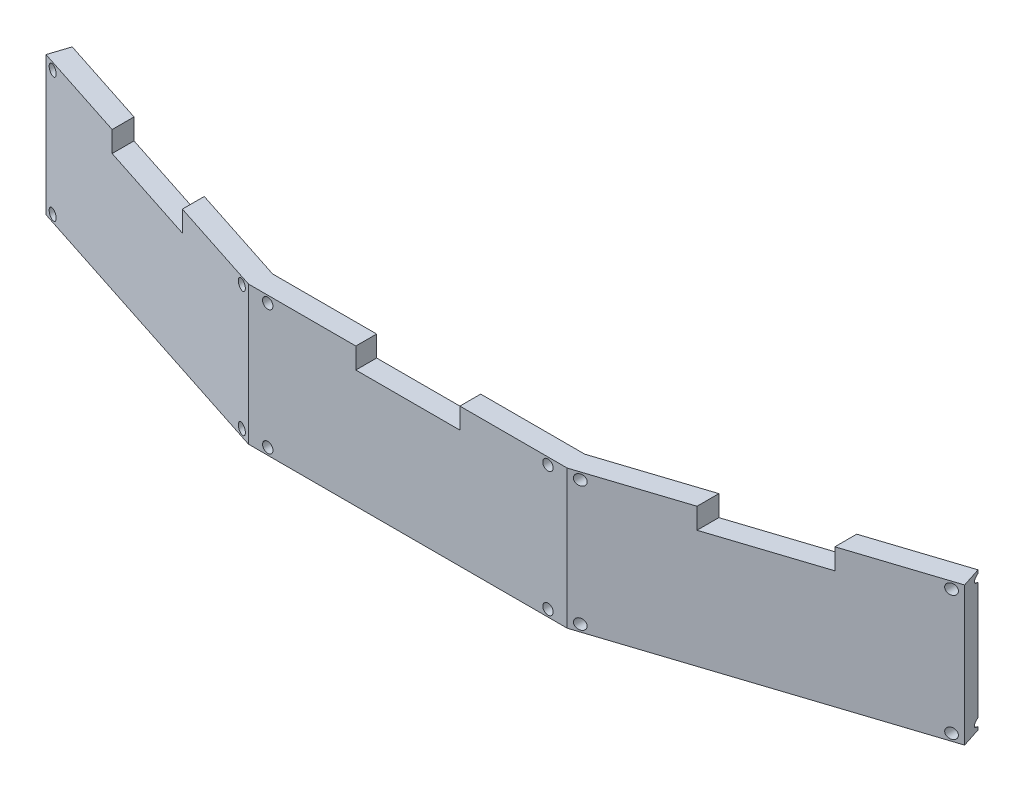
ISO-10303-21;
HEADER;
FILE_DESCRIPTION(('STEP AP214'),'2;1');
FILE_NAME('part.step','',(''),(''),'','','');
FILE_SCHEMA(('AUTOMOTIVE_DESIGN { 1 0 10303 214 1 1 1 1 }'));
ENDSEC;
DATA;
#1=APPLICATION_CONTEXT('core data for automotive mechanical design processes');
#2=APPLICATION_PROTOCOL_DEFINITION('international standard','automotive_design',2000,#1);
#3=PRODUCT_CONTEXT('',#1,'mechanical');
#4=PRODUCT('Part','Part','',(#3));
#5=PRODUCT_RELATED_PRODUCT_CATEGORY('part','',(#4));
#6=PRODUCT_DEFINITION_FORMATION('','',#4);
#7=PRODUCT_DEFINITION_CONTEXT('part definition',#1,'design');
#8=PRODUCT_DEFINITION('design','',#6,#7);
#9=PRODUCT_DEFINITION_SHAPE('','',#8);
#10=(LENGTH_UNIT() NAMED_UNIT(*) SI_UNIT(.MILLI.,.METRE.));
#11=(NAMED_UNIT(*) PLANE_ANGLE_UNIT() SI_UNIT($,.RADIAN.));
#12=(NAMED_UNIT(*) SI_UNIT($,.STERADIAN.) SOLID_ANGLE_UNIT());
#13=UNCERTAINTY_MEASURE_WITH_UNIT(LENGTH_MEASURE(1.E-05),#10,'distance_accuracy_value','');
#14=(GEOMETRIC_REPRESENTATION_CONTEXT(3) GLOBAL_UNCERTAINTY_ASSIGNED_CONTEXT((#13)) GLOBAL_UNIT_ASSIGNED_CONTEXT((#10,
#11,#12)) REPRESENTATION_CONTEXT('',''));
#15=CARTESIAN_POINT('',(0.,0.,0.));
#16=DIRECTION('',(0.,0.,1.));
#17=DIRECTION('',(1.,0.,0.));
#18=AXIS2_PLACEMENT_3D('',#15,#16,#17);
#19=CARTESIAN_POINT('',(0.,0.,0.));
#20=DIRECTION('',(0.,-1.,0.));
#21=DIRECTION('',(-1.,0.,0.));
#22=AXIS2_PLACEMENT_3D('',#19,#20,#21);
#23=PLANE('',#22);
#24=DIRECTION('',(0.951056516295156,0.,-0.309016994374941));
#25=VECTOR('',#24,1.);
#26=CARTESIAN_POINT('',(23.4270509831248,0.,2.85316954888546));
#27=LINE('',#26,#25);
#28=CARTESIAN_POINT('',(22.9751533209736,0.,2.99999999999999));
#29=VERTEX_POINT('',#28);
#30=CARTESIAN_POINT('',(37.0998737686902,0.,-1.58939987724671));
#31=VERTEX_POINT('',#30);
#32=EDGE_CURVE('E356',#29,#31,#27,.T.);
#33=ORIENTED_EDGE('',*,*,#32,.T.);
#34=DIRECTION('',(0.,0.,-1.));
#35=VECTOR('',#34,1.);
#36=CARTESIAN_POINT('',(37.0998737686902,0.,0.));
#37=LINE('',#36,#35);
#38=CARTESIAN_POINT('',(37.0998737686902,0.,-4.74378654996151));
#39=VERTEX_POINT('',#38);
#40=EDGE_CURVE('E443',#31,#39,#37,.T.);
#41=ORIENTED_EDGE('',*,*,#40,.T.);
#42=DIRECTION('',(0.951056516295156,0.,-0.309016994374941));
#43=VECTOR('',#42,1.);
#44=CARTESIAN_POINT('',(22.5,0.,0.));
#45=LINE('',#44,#43);
#46=CARTESIAN_POINT('',(22.5,0.,0.));
#47=VERTEX_POINT('',#46);
#48=EDGE_CURVE('E365',#47,#39,#45,.T.);
#49=ORIENTED_EDGE('',*,*,#48,.F.);
#50=DIRECTION('',(1.,0.,0.));
#51=VECTOR('',#50,1.);
#52=CARTESIAN_POINT('',(-22.5,0.,0.));
#53=LINE('',#52,#51);
#54=CARTESIAN_POINT('',(7.5,0.,0.));
#55=VERTEX_POINT('',#54);
#56=EDGE_CURVE('E369',#55,#47,#53,.T.);
#57=ORIENTED_EDGE('',*,*,#56,.F.);
#58=DIRECTION('',(0.,0.,1.));
#59=VECTOR('',#58,1.);
#60=CARTESIAN_POINT('',(7.5,0.,0.));
#61=LINE('',#60,#59);
#62=CARTESIAN_POINT('',(7.5,0.,2.99999999999999));
#63=VERTEX_POINT('',#62);
#64=EDGE_CURVE('E395',#55,#63,#61,.T.);
#65=ORIENTED_EDGE('',*,*,#64,.T.);
#66=DIRECTION('',(1.,0.,0.));
#67=VECTOR('',#66,1.);
#68=CARTESIAN_POINT('',(-22.5,0.,3.));
#69=LINE('',#68,#67);
#70=EDGE_CURVE('E388',#63,#29,#69,.T.);
#71=ORIENTED_EDGE('',*,*,#70,.T.);
#72=EDGE_LOOP('',(#33,#41,#49,#57,#65,#71));
#73=FACE_BOUND('',#72,.T.);
#74=ADVANCED_FACE('F39',(#73),#23,.F.);
#75=DIRECTION('',(0.951056516295156,0.,0.309016994374941));
#76=VECTOR('',#75,1.);
#77=CARTESIAN_POINT('',(-22.5,0.,0.));
#78=LINE('',#77,#76);
#79=CARTESIAN_POINT('',(-37.0998737686902,-2.21748724036974E-13,-4.7437865499615));
#80=VERTEX_POINT('',#79);
#81=CARTESIAN_POINT('',(-22.5,0.,0.));
#82=VERTEX_POINT('',#81);
#83=EDGE_CURVE('E374',#80,#82,#78,.T.);
#84=ORIENTED_EDGE('',*,*,#83,.F.);
#85=DIRECTION('',(0.,0.,1.));
#86=VECTOR('',#85,1.);
#87=CARTESIAN_POINT('',(-37.0998737686902,0.,0.));
#88=LINE('',#87,#86);
#89=CARTESIAN_POINT('',(-37.0998737686902,-2.21748724036974E-13,-1.58939987724671));
#90=VERTEX_POINT('',#89);
#91=EDGE_CURVE('E435',#80,#90,#88,.T.);
#92=ORIENTED_EDGE('',*,*,#91,.T.);
#93=DIRECTION('',(0.951056516295156,0.,0.309016994374941));
#94=VECTOR('',#93,1.);
#95=CARTESIAN_POINT('',(-23.4270509831248,0.,2.85316954888547));
#96=LINE('',#95,#94);
#97=CARTESIAN_POINT('',(-22.9751533209736,0.,3.));
#98=VERTEX_POINT('',#97);
#99=EDGE_CURVE('E383',#90,#98,#96,.T.);
#100=ORIENTED_EDGE('',*,*,#99,.T.);
#101=CARTESIAN_POINT('',(-7.5,0.,3.));
#102=VERTEX_POINT('',#101);
#103=EDGE_CURVE('E332',#98,#102,#69,.T.);
#104=ORIENTED_EDGE('',*,*,#103,.T.);
#105=DIRECTION('',(0.,0.,-1.));
#106=VECTOR('',#105,1.);
#107=CARTESIAN_POINT('',(-7.5,0.,0.));
#108=LINE('',#107,#106);
#109=CARTESIAN_POINT('',(-7.5,0.,0.));
#110=VERTEX_POINT('',#109);
#111=EDGE_CURVE('E219',#102,#110,#108,.T.);
#112=ORIENTED_EDGE('',*,*,#111,.T.);
#113=EDGE_CURVE('E370',#82,#110,#53,.T.);
#114=ORIENTED_EDGE('',*,*,#113,.F.);
#115=EDGE_LOOP('',(#84,#92,#100,#104,#112,#114));
#116=FACE_BOUND('',#115,.T.);
#117=ADVANCED_FACE('F514',(#116),#23,.F.);
#118=CARTESIAN_POINT('',(-66.2245942164068,0.,-11.0525951979869));
#119=VERTEX_POINT('',#118);
#120=CARTESIAN_POINT('',(-52.0998737686902,-4.41037873663923E-13,-6.46319532074019));
#121=VERTEX_POINT('',#120);
#122=EDGE_CURVE('E384',#119,#121,#96,.T.);
#123=ORIENTED_EDGE('',*,*,#122,.T.);
#124=DIRECTION('',(0.,0.,-1.));
#125=VECTOR('',#124,1.);
#126=CARTESIAN_POINT('',(-52.0998737686902,0.,0.));
#127=LINE('',#126,#125);
#128=CARTESIAN_POINT('',(-52.0998737686902,0.,-9.61758199345499));
#129=VERTEX_POINT('',#128);
#130=EDGE_CURVE('E431',#121,#129,#127,.T.);
#131=ORIENTED_EDGE('',*,*,#130,.T.);
#132=CARTESIAN_POINT('',(-65.297543233282,0.,-13.9057647468724));
#133=VERTEX_POINT('',#132);
#134=EDGE_CURVE('E375',#133,#129,#78,.T.);
#135=ORIENTED_EDGE('',*,*,#134,.F.);
#136=DIRECTION('',(0.309016994374943,0.,-0.951056516295155));
#137=VECTOR('',#136,1.);
#138=CARTESIAN_POINT('',(-66.2245942164068,0.,-11.0525951979869));
#139=LINE('',#138,#137);
#140=EDGE_CURVE('E379',#119,#133,#139,.T.);
#141=ORIENTED_EDGE('',*,*,#140,.F.);
#142=EDGE_LOOP('',(#123,#131,#135,#141));
#143=FACE_BOUND('',#142,.T.);
#144=ADVANCED_FACE('F521',(#143),#23,.F.);
#145=CARTESIAN_POINT('',(23.4270509831248,-20.,2.85316954888546));
#146=DIRECTION('',(0.309016994374941,0.,0.951056516295156));
#147=DIRECTION('',(0.951056516295156,0.,-0.309016994374941));
#148=AXIS2_PLACEMENT_3D('',#145,#146,#147);
#149=PLANE('',#148);
#150=CARTESIAN_POINT('',(24.3998737686902,-0.999999999999996,2.53708026491111));
#151=DIRECTION('',(0.309016994374941,0.,0.951056516295156));
#152=DIRECTION('',(-0.951056516295156,0.,0.309016994374941));
#153=AXIS2_PLACEMENT_3D('',#150,#151,#152);
#154=ELLIPSE('',#153,0.788596668178701,0.750000000000002);
#155=CARTESIAN_POINT('',(23.6498737686902,-0.999999999999996,2.78077003708578));
#156=VERTEX_POINT('',#155);
#157=EDGE_CURVE('E296',#156,#156,#154,.T.);
#158=ORIENTED_EDGE('',*,*,#157,.F.);
#159=EDGE_LOOP('',(#158));
#160=FACE_BOUND('',#159,.T.);
#161=CARTESIAN_POINT('',(64.7998737686902,-1.,-10.589675462898));
#162=DIRECTION('',(0.309016994374941,0.,0.951056516295156));
#163=DIRECTION('',(-0.951056516295156,0.,0.309016994374941));
#164=AXIS2_PLACEMENT_3D('',#161,#162,#163);
#165=ELLIPSE('',#164,0.788596668178697,0.749999999999999);
#166=CARTESIAN_POINT('',(64.0498737686902,-1.,-10.3459856907233));
#167=VERTEX_POINT('',#166);
#168=EDGE_CURVE('E283',#167,#167,#165,.T.);
#169=ORIENTED_EDGE('',*,*,#168,.F.);
#170=EDGE_LOOP('',(#169));
#171=FACE_BOUND('',#170,.T.);
#172=DIRECTION('',(0.,-1.,0.));
#173=VECTOR('',#172,1.);
#174=CARTESIAN_POINT('',(37.0998737686902,-20.,-1.58939987724671));
#175=LINE('',#174,#173);
#176=CARTESIAN_POINT('',(37.0998737686902,-3.,-1.58939987724671));
#177=VERTEX_POINT('',#176);
#178=EDGE_CURVE('E268',#31,#177,#175,.T.);
#179=ORIENTED_EDGE('',*,*,#178,.F.);
#180=ORIENTED_EDGE('',*,*,#32,.F.);
#181=DIRECTION('',(0.,1.,0.));
#182=VECTOR('',#181,1.);
#183=CARTESIAN_POINT('',(22.9751533209736,-20.,2.99999999999999));
#184=LINE('',#183,#182);
#185=CARTESIAN_POINT('',(22.9751533209736,-20.,2.99999999999999));
#186=VERTEX_POINT('',#185);
#187=EDGE_CURVE('E391',#186,#29,#184,.T.);
#188=ORIENTED_EDGE('',*,*,#187,.F.);
#189=DIRECTION('',(0.951056516295156,0.,-0.309016994374941));
#190=VECTOR('',#189,1.);
#191=CARTESIAN_POINT('',(23.4270509831248,-20.,2.85316954888546));
#192=LINE('',#191,#190);
#193=CARTESIAN_POINT('',(66.2245942164068,-20.,-11.0525951979869));
#194=VERTEX_POINT('',#193);
#195=EDGE_CURVE('E327',#186,#194,#192,.T.);
#196=ORIENTED_EDGE('',*,*,#195,.T.);
#197=DIRECTION('',(0.,1.,0.));
#198=VECTOR('',#197,1.);
#199=CARTESIAN_POINT('',(66.2245942164068,-20.,-11.0525951979869));
#200=LINE('',#199,#198);
#201=CARTESIAN_POINT('',(66.2245942164068,0.,-11.0525951979869));
#202=VERTEX_POINT('',#201);
#203=EDGE_CURVE('E355',#194,#202,#200,.T.);
#204=ORIENTED_EDGE('',*,*,#203,.T.);
#205=CARTESIAN_POINT('',(52.0998737686902,0.,-6.4631953207402));
#206=VERTEX_POINT('',#205);
#207=EDGE_CURVE('E326',#206,#202,#27,.T.);
#208=ORIENTED_EDGE('',*,*,#207,.F.);
#209=DIRECTION('',(0.,1.,0.));
#210=VECTOR('',#209,1.);
#211=CARTESIAN_POINT('',(52.0998737686902,-20.,-6.46319532074019));
#212=LINE('',#211,#210);
#213=CARTESIAN_POINT('',(52.0998737686902,-3.,-6.4631953207402));
#214=VERTEX_POINT('',#213);
#215=EDGE_CURVE('E261',#214,#206,#212,.T.);
#216=ORIENTED_EDGE('',*,*,#215,.F.);
#217=DIRECTION('',(0.951056516295156,0.,-0.309016994374941));
#218=VECTOR('',#217,1.);
#219=CARTESIAN_POINT('',(23.4270509831248,-3.,2.85316954888546));
#220=LINE('',#219,#218);
#221=EDGE_CURVE('E292',#177,#214,#220,.T.);
#222=ORIENTED_EDGE('',*,*,#221,.F.);
#223=EDGE_LOOP('',(#179,#180,#188,#196,#204,#208,#216,#222));
#224=FACE_BOUND('',#223,.T.);
#225=CARTESIAN_POINT('',(24.3998737686902,-19.,2.53708026491111));
#226=DIRECTION('',(0.309016994374941,0.,0.951056516295156));
#227=DIRECTION('',(-0.951056516295156,0.,0.309016994374941));
#228=AXIS2_PLACEMENT_3D('',#225,#226,#227);
#229=ELLIPSE('',#228,0.788596668178701,0.750000000000002);
#230=CARTESIAN_POINT('',(23.6498737686902,-19.,2.78077003708578));
#231=VERTEX_POINT('',#230);
#232=EDGE_CURVE('E288',#231,#231,#229,.T.);
#233=ORIENTED_EDGE('',*,*,#232,.F.);
#234=EDGE_LOOP('',(#233));
#235=FACE_BOUND('',#234,.T.);
#236=CARTESIAN_POINT('',(64.7998737686902,-19.,-10.589675462898));
#237=DIRECTION('',(0.309016994374941,0.,0.951056516295156));
#238=DIRECTION('',(-0.951056516295156,0.,0.309016994374941));
#239=AXIS2_PLACEMENT_3D('',#236,#237,#238);
#240=ELLIPSE('',#239,0.788596668178697,0.749999999999999);
#241=CARTESIAN_POINT('',(64.0498737686902,-19.,-10.3459856907233));
#242=VERTEX_POINT('',#241);
#243=EDGE_CURVE('E275',#242,#242,#240,.T.);
#244=ORIENTED_EDGE('',*,*,#243,.F.);
#245=EDGE_LOOP('',(#244));
#246=FACE_BOUND('',#245,.T.);
#247=ADVANCED_FACE('F41',(#160,#171,#224,#235,#246),#149,.T.);
#248=CARTESIAN_POINT('',(-22.5,-20.,3.));
#249=DIRECTION('',(0.,0.,1.));
#250=DIRECTION('',(1.,0.,0.));
#251=AXIS2_PLACEMENT_3D('',#248,#249,#250);
#252=PLANE('',#251);
#253=CARTESIAN_POINT('',(-20.2,-19.,3.));
#254=DIRECTION('',(0.,0.,1.));
#255=DIRECTION('',(1.,0.,0.));
#256=AXIS2_PLACEMENT_3D('',#253,#254,#255);
#257=CIRCLE('',#256,0.750000000000002);
#258=CARTESIAN_POINT('',(-19.45,-19.,3.));
#259=VERTEX_POINT('',#258);
#260=EDGE_CURVE('E563',#259,#259,#257,.T.);
#261=ORIENTED_EDGE('',*,*,#260,.F.);
#262=EDGE_LOOP('',(#261));
#263=FACE_BOUND('',#262,.T.);
#264=CARTESIAN_POINT('',(20.2,-19.,3.));
#265=DIRECTION('',(0.,0.,1.));
#266=DIRECTION('',(-1.,0.,0.));
#267=AXIS2_PLACEMENT_3D('',#264,#265,#266);
#268=CIRCLE('',#267,0.750000000000002);
#269=CARTESIAN_POINT('',(19.45,-19.,3.));
#270=VERTEX_POINT('',#269);
#271=EDGE_CURVE('E569',#270,#270,#268,.T.);
#272=ORIENTED_EDGE('',*,*,#271,.F.);
#273=EDGE_LOOP('',(#272));
#274=FACE_BOUND('',#273,.T.);
#275=CARTESIAN_POINT('',(20.2,-0.999999999999996,3.));
#276=DIRECTION('',(0.,0.,1.));
#277=DIRECTION('',(-1.,0.,0.));
#278=AXIS2_PLACEMENT_3D('',#275,#276,#277);
#279=CIRCLE('',#278,0.750000000000002);
#280=CARTESIAN_POINT('',(19.45,-0.999999999999996,3.));
#281=VERTEX_POINT('',#280);
#282=EDGE_CURVE('E582',#281,#281,#279,.T.);
#283=ORIENTED_EDGE('',*,*,#282,.F.);
#284=EDGE_LOOP('',(#283));
#285=FACE_BOUND('',#284,.T.);
#286=CARTESIAN_POINT('',(-20.2,-0.999999999999996,3.));
#287=DIRECTION('',(0.,0.,1.));
#288=DIRECTION('',(1.,0.,0.));
#289=AXIS2_PLACEMENT_3D('',#286,#287,#288);
#290=CIRCLE('',#289,0.750000000000002);
#291=CARTESIAN_POINT('',(-19.45,-0.999999999999996,3.));
#292=VERTEX_POINT('',#291);
#293=EDGE_CURVE('E578',#292,#292,#290,.T.);
#294=ORIENTED_EDGE('',*,*,#293,.F.);
#295=EDGE_LOOP('',(#294));
#296=FACE_BOUND('',#295,.T.);
#297=DIRECTION('',(0.,-1.,0.));
#298=VECTOR('',#297,1.);
#299=CARTESIAN_POINT('',(-7.5,0.,3.));
#300=LINE('',#299,#298);
#301=CARTESIAN_POINT('',(-7.5,-3.,3.));
#302=VERTEX_POINT('',#301);
#303=EDGE_CURVE('E216',#102,#302,#300,.T.);
#304=ORIENTED_EDGE('',*,*,#303,.F.);
#305=ORIENTED_EDGE('',*,*,#103,.F.);
#306=DIRECTION('',(0.,1.,0.));
#307=VECTOR('',#306,1.);
#308=CARTESIAN_POINT('',(-22.9751533209736,-20.,3.));
#309=LINE('',#308,#307);
#310=CARTESIAN_POINT('',(-22.9751533209736,-20.,3.));
#311=VERTEX_POINT('',#310);
#312=EDGE_CURVE('E396',#311,#98,#309,.T.);
#313=ORIENTED_EDGE('',*,*,#312,.F.);
#314=DIRECTION('',(1.,0.,0.));
#315=VECTOR('',#314,1.);
#316=CARTESIAN_POINT('',(-22.5,-20.,3.));
#317=LINE('',#316,#315);
#318=EDGE_CURVE('E351',#311,#186,#317,.T.);
#319=ORIENTED_EDGE('',*,*,#318,.T.);
#320=ORIENTED_EDGE('',*,*,#187,.T.);
#321=ORIENTED_EDGE('',*,*,#70,.F.);
#322=DIRECTION('',(0.,1.,0.));
#323=VECTOR('',#322,1.);
#324=CARTESIAN_POINT('',(7.5,0.,3.));
#325=LINE('',#324,#323);
#326=CARTESIAN_POINT('',(7.5,-3.,3.));
#327=VERTEX_POINT('',#326);
#328=EDGE_CURVE('E213',#327,#63,#325,.T.);
#329=ORIENTED_EDGE('',*,*,#328,.F.);
#330=DIRECTION('',(1.,0.,0.));
#331=VECTOR('',#330,1.);
#332=CARTESIAN_POINT('',(-7.5,-3.,3.));
#333=LINE('',#332,#331);
#334=EDGE_CURVE('E205',#302,#327,#333,.T.);
#335=ORIENTED_EDGE('',*,*,#334,.F.);
#336=EDGE_LOOP('',(#304,#305,#313,#319,#320,#321,#329,#335));
#337=FACE_BOUND('',#336,.T.);
#338=ADVANCED_FACE('F226',(#263,#274,#285,#296,#337),#252,.T.);
#339=CARTESIAN_POINT('',(-23.4270509831248,-20.,2.85316954888547));
#340=DIRECTION('',(-0.309016994374941,0.,0.951056516295156));
#341=DIRECTION('',(0.951056516295156,0.,0.309016994374941));
#342=AXIS2_PLACEMENT_3D('',#339,#340,#341);
#343=PLANE('',#342);
#344=CARTESIAN_POINT('',(-64.7998737686902,-19.,-10.589675462898));
#345=DIRECTION('',(-0.309016994374941,0.,0.951056516295156));
#346=DIRECTION('',(0.951056516295156,0.,0.309016994374941));
#347=AXIS2_PLACEMENT_3D('',#344,#345,#346);
#348=ELLIPSE('',#347,0.788596668178697,0.749999999999999);
#349=CARTESIAN_POINT('',(-64.0498737686902,-19.,-10.3459856907233));
#350=VERTEX_POINT('',#349);
#351=EDGE_CURVE('E322',#350,#350,#348,.T.);
#352=ORIENTED_EDGE('',*,*,#351,.F.);
#353=EDGE_LOOP('',(#352));
#354=FACE_BOUND('',#353,.T.);
#355=CARTESIAN_POINT('',(-24.3998737686902,-19.,2.53708026491112));
#356=DIRECTION('',(-0.309016994374941,0.,0.951056516295156));
#357=DIRECTION('',(0.951056516295156,0.,0.309016994374941));
#358=AXIS2_PLACEMENT_3D('',#355,#356,#357);
#359=ELLIPSE('',#358,0.788596668178701,0.750000000000002);
#360=CARTESIAN_POINT('',(-23.6498737686902,-19.,2.78077003708579));
#361=VERTEX_POINT('',#360);
#362=EDGE_CURVE('E316',#361,#361,#359,.T.);
#363=ORIENTED_EDGE('',*,*,#362,.F.);
#364=EDGE_LOOP('',(#363));
#365=FACE_BOUND('',#364,.T.);
#366=DIRECTION('',(0.,1.,0.));
#367=VECTOR('',#366,1.);
#368=CARTESIAN_POINT('',(-37.0998737686901,-20.0000000000001,-1.58939987724668));
#369=LINE('',#368,#367);
#370=CARTESIAN_POINT('',(-37.0998737686902,-3.00000000000022,-1.5893998772467));
#371=VERTEX_POINT('',#370);
#372=EDGE_CURVE('E254',#371,#90,#369,.T.);
#373=ORIENTED_EDGE('',*,*,#372,.F.);
#374=DIRECTION('',(0.951056516295156,0.,0.309016994374941));
#375=VECTOR('',#374,1.);
#376=CARTESIAN_POINT('',(-23.427050983125,-3.00000000000002,2.85316954888539));
#377=LINE('',#376,#375);
#378=CARTESIAN_POINT('',(-52.0998737686902,-3.00000000000044,-6.46319532074019));
#379=VERTEX_POINT('',#378);
#380=EDGE_CURVE('E312',#379,#371,#377,.T.);
#381=ORIENTED_EDGE('',*,*,#380,.F.);
#382=DIRECTION('',(0.,-1.,0.));
#383=VECTOR('',#382,1.);
#384=CARTESIAN_POINT('',(-52.0998737686901,-20.0000000000001,-6.46319532074016));
#385=LINE('',#384,#383);
#386=EDGE_CURVE('E247',#121,#379,#385,.T.);
#387=ORIENTED_EDGE('',*,*,#386,.F.);
#388=ORIENTED_EDGE('',*,*,#122,.F.);
#389=DIRECTION('',(0.,1.,0.));
#390=VECTOR('',#389,1.);
#391=CARTESIAN_POINT('',(-66.2245942164068,-20.,-11.0525951979869));
#392=LINE('',#391,#390);
#393=CARTESIAN_POINT('',(-66.2245942164068,-20.,-11.0525951979869));
#394=VERTEX_POINT('',#393);
#395=EDGE_CURVE('E400',#394,#119,#392,.T.);
#396=ORIENTED_EDGE('',*,*,#395,.F.);
#397=DIRECTION('',(0.951056516295156,0.,0.309016994374941));
#398=VECTOR('',#397,1.);
#399=CARTESIAN_POINT('',(-23.4270509831248,-20.,2.85316954888547));
#400=LINE('',#399,#398);
#401=EDGE_CURVE('E347',#394,#311,#400,.T.);
#402=ORIENTED_EDGE('',*,*,#401,.T.);
#403=ORIENTED_EDGE('',*,*,#312,.T.);
#404=ORIENTED_EDGE('',*,*,#99,.F.);
#405=EDGE_LOOP('',(#373,#381,#387,#388,#396,#402,#403,#404));
#406=FACE_BOUND('',#405,.T.);
#407=CARTESIAN_POINT('',(-64.7998737686902,-1.,-10.589675462898));
#408=DIRECTION('',(-0.309016994374941,0.,0.951056516295156));
#409=DIRECTION('',(0.951056516295156,0.,0.309016994374941));
#410=AXIS2_PLACEMENT_3D('',#407,#408,#409);
#411=ELLIPSE('',#410,0.788596668178697,0.749999999999999);
#412=CARTESIAN_POINT('',(-64.0498737686902,-1.,-10.3459856907233));
#413=VERTEX_POINT('',#412);
#414=EDGE_CURVE('E308',#413,#413,#411,.T.);
#415=ORIENTED_EDGE('',*,*,#414,.F.);
#416=EDGE_LOOP('',(#415));
#417=FACE_BOUND('',#416,.T.);
#418=CARTESIAN_POINT('',(-24.3998737686902,-0.999999999999996,2.53708026491112));
#419=DIRECTION('',(-0.309016994374941,0.,0.951056516295156));
#420=DIRECTION('',(0.951056516295156,0.,0.309016994374941));
#421=AXIS2_PLACEMENT_3D('',#418,#419,#420);
#422=ELLIPSE('',#421,0.788596668178701,0.750000000000002);
#423=CARTESIAN_POINT('',(-23.6498737686902,-0.999999999999996,2.78077003708579));
#424=VERTEX_POINT('',#423);
#425=EDGE_CURVE('E301',#424,#424,#422,.T.);
#426=ORIENTED_EDGE('',*,*,#425,.F.);
#427=EDGE_LOOP('',(#426));
#428=FACE_BOUND('',#427,.T.);
#429=ADVANCED_FACE('F548',(#354,#365,#406,#417,#428),#343,.T.);
#430=CARTESIAN_POINT('',(-66.2245942164068,-20.,-11.0525951979869));
#431=DIRECTION('',(0.951056516295155,0.,0.309016994374943));
#432=DIRECTION('',(0.309016994374943,0.,-0.951056516295155));
#433=AXIS2_PLACEMENT_3D('',#430,#431,#432);
#434=PLANE('',#433);
#435=DIRECTION('',(0.,1.,0.));
#436=VECTOR('',#435,1.);
#437=CARTESIAN_POINT('',(-65.297543233282,-20.,-13.9057647468724));
#438=LINE('',#437,#436);
#439=CARTESIAN_POINT('',(-65.297543233282,-18.4389072233463,-13.9057647468724));
#440=VERTEX_POINT('',#439);
#441=CARTESIAN_POINT('',(-65.297543233282,-1.56109277665367,-13.9057647468724));
#442=VERTEX_POINT('',#441);
#443=EDGE_CURVE('E407',#440,#442,#438,.T.);
#444=ORIENTED_EDGE('',*,*,#443,.F.);
#445=CARTESIAN_POINT('',(-64.7998737686902,-19.,-15.4374338650014));
#446=DIRECTION('',(0.951056516295155,0.,0.309016994374943));
#447=DIRECTION('',(-0.309016994374943,0.,0.951056516295155));
#448=AXIS2_PLACEMENT_3D('',#445,#446,#447);
#449=ELLIPSE('',#448,2.42705098312487,0.749999999999999);
#450=CARTESIAN_POINT('',(-65.297543233282,-19.5610927766537,-13.9057647468724));
#451=VERTEX_POINT('',#450);
#452=EDGE_CURVE('E61',#440,#451,#449,.T.);
#453=ORIENTED_EDGE('',*,*,#452,.T.);
#454=CARTESIAN_POINT('',(-65.297543233282,-20.,-13.9057647468724));
#455=VERTEX_POINT('',#454);
#456=EDGE_CURVE('E403',#455,#451,#438,.T.);
#457=ORIENTED_EDGE('',*,*,#456,.F.);
#458=DIRECTION('',(0.309016994374943,0.,-0.951056516295155));
#459=VECTOR('',#458,1.);
#460=CARTESIAN_POINT('',(-66.2245942164068,-20.,-11.0525951979869));
#461=LINE('',#460,#459);
#462=EDGE_CURVE('E344',#394,#455,#461,.T.);
#463=ORIENTED_EDGE('',*,*,#462,.F.);
#464=ORIENTED_EDGE('',*,*,#395,.T.);
#465=ORIENTED_EDGE('',*,*,#140,.T.);
#466=CARTESIAN_POINT('',(-65.297543233282,-0.438907223346333,-13.9057647468724));
#467=VERTEX_POINT('',#466);
#468=EDGE_CURVE('E408',#467,#133,#438,.T.);
#469=ORIENTED_EDGE('',*,*,#468,.F.);
#470=CARTESIAN_POINT('',(-64.7998737686902,-1.,-15.4374338650014));
#471=DIRECTION('',(0.951056516295155,0.,0.309016994374943));
#472=DIRECTION('',(-0.309016994374943,0.,0.951056516295155));
#473=AXIS2_PLACEMENT_3D('',#470,#471,#472);
#474=ELLIPSE('',#473,2.42705098312487,0.749999999999999);
#475=EDGE_CURVE('E54',#467,#442,#474,.T.);
#476=ORIENTED_EDGE('',*,*,#475,.T.);
#477=EDGE_LOOP('',(#444,#453,#457,#463,#464,#465,#469,#476));
#478=FACE_BOUND('',#477,.T.);
#479=ADVANCED_FACE('F824',(#478),#434,.F.);
#480=CARTESIAN_POINT('',(-22.5,-20.,0.));
#481=DIRECTION('',(-0.309016994374941,0.,0.951056516295156));
#482=DIRECTION('',(0.951056516295156,0.,0.309016994374941));
#483=AXIS2_PLACEMENT_3D('',#480,#481,#482);
#484=PLANE('',#483);
#485=CARTESIAN_POINT('',(-24.3998737686902,-19.,-0.61730640780368));
#486=DIRECTION('',(-0.309016994374941,0.,0.951056516295156));
#487=DIRECTION('',(0.951056516295156,0.,0.309016994374941));
#488=AXIS2_PLACEMENT_3D('',#485,#486,#487);
#489=ELLIPSE('',#488,0.788596668178701,0.750000000000002);
#490=CARTESIAN_POINT('',(-23.6498737686902,-19.,-0.373616635629004));
#491=VERTEX_POINT('',#490);
#492=EDGE_CURVE('E315',#491,#491,#489,.T.);
#493=ORIENTED_EDGE('',*,*,#492,.T.);
#494=EDGE_LOOP('',(#493));
#495=FACE_BOUND('',#494,.T.);
#496=CARTESIAN_POINT('',(-24.3998737686902,-0.999999999999996,-0.61730640780368));
#497=DIRECTION('',(-0.309016994374941,0.,0.951056516295156));
#498=DIRECTION('',(0.951056516295156,0.,0.309016994374941));
#499=AXIS2_PLACEMENT_3D('',#496,#497,#498);
#500=ELLIPSE('',#499,0.788596668178701,0.750000000000002);
#501=CARTESIAN_POINT('',(-23.6498737686902,-0.999999999999996,-0.373616635629004));
#502=VERTEX_POINT('',#501);
#503=EDGE_CURVE('E305',#502,#502,#500,.T.);
#504=ORIENTED_EDGE('',*,*,#503,.T.);
#505=EDGE_LOOP('',(#504));
#506=FACE_BOUND('',#505,.T.);
#507=ORIENTED_EDGE('',*,*,#456,.T.);
#508=CARTESIAN_POINT('',(-64.7998737686902,-19.,-13.7440621356128));
#509=DIRECTION('',(-0.309016994374941,0.,0.951056516295156));
#510=DIRECTION('',(0.951056516295156,0.,0.309016994374941));
#511=AXIS2_PLACEMENT_3D('',#508,#509,#510);
#512=ELLIPSE('',#511,0.788596668178697,0.749999999999999);
#513=EDGE_CURVE('E11',#451,#440,#512,.T.);
#514=ORIENTED_EDGE('',*,*,#513,.T.);
#515=ORIENTED_EDGE('',*,*,#443,.T.);
#516=CARTESIAN_POINT('',(-64.7998737686902,-1.,-13.7440621356128));
#517=DIRECTION('',(-0.309016994374941,0.,0.951056516295156));
#518=DIRECTION('',(0.951056516295156,0.,0.309016994374941));
#519=AXIS2_PLACEMENT_3D('',#516,#517,#518);
#520=ELLIPSE('',#519,0.788596668178697,0.749999999999999);
#521=EDGE_CURVE('E467',#442,#467,#520,.T.);
#522=ORIENTED_EDGE('',*,*,#521,.T.);
#523=ORIENTED_EDGE('',*,*,#468,.T.);
#524=ORIENTED_EDGE('',*,*,#134,.T.);
#525=DIRECTION('',(0.,-1.,0.));
#526=VECTOR('',#525,1.);
#527=CARTESIAN_POINT('',(-52.0998737686901,-20.0000000000002,-9.61758199345496));
#528=LINE('',#527,#526);
#529=CARTESIAN_POINT('',(-52.0998737686902,-3.00000000000044,-9.61758199345499));
#530=VERTEX_POINT('',#529);
#531=EDGE_CURVE('E243',#129,#530,#528,.T.);
#532=ORIENTED_EDGE('',*,*,#531,.T.);
#533=DIRECTION('',(0.951056516295156,0.,0.309016994374941));
#534=VECTOR('',#533,1.);
#535=CARTESIAN_POINT('',(-22.5000000000002,-3.00000000000001,0.));
#536=LINE('',#535,#534);
#537=CARTESIAN_POINT('',(-37.0998737686902,-3.00000000000022,-4.7437865499615));
#538=VERTEX_POINT('',#537);
#539=EDGE_CURVE('E48',#530,#538,#536,.T.);
#540=ORIENTED_EDGE('',*,*,#539,.T.);
#541=DIRECTION('',(0.,1.,0.));
#542=VECTOR('',#541,1.);
#543=CARTESIAN_POINT('',(-37.0998737686901,-20.0000000000001,-4.74378654996147));
#544=LINE('',#543,#542);
#545=EDGE_CURVE('E250',#538,#80,#544,.T.);
#546=ORIENTED_EDGE('',*,*,#545,.T.);
#547=ORIENTED_EDGE('',*,*,#83,.T.);
#548=DIRECTION('',(0.,1.,0.));
#549=VECTOR('',#548,1.);
#550=CARTESIAN_POINT('',(-22.5,-20.,0.));
#551=LINE('',#550,#549);
#552=CARTESIAN_POINT('',(-22.5,-20.,0.));
#553=VERTEX_POINT('',#552);
#554=EDGE_CURVE('E409',#553,#82,#551,.T.);
#555=ORIENTED_EDGE('',*,*,#554,.F.);
#556=DIRECTION('',(0.951056516295156,0.,0.309016994374941));
#557=VECTOR('',#556,1.);
#558=CARTESIAN_POINT('',(-22.5,-20.,0.));
#559=LINE('',#558,#557);
#560=EDGE_CURVE('E341',#455,#553,#559,.T.);
#561=ORIENTED_EDGE('',*,*,#560,.F.);
#562=EDGE_LOOP('',(#507,#514,#515,#522,#523,#524,#532,#540,#546,#547,#555,#561));
#563=FACE_BOUND('',#562,.T.);
#564=ADVANCED_FACE('F494',(#495,#506,#563),#484,.F.);
#565=CARTESIAN_POINT('',(-22.5,-20.,0.));
#566=DIRECTION('',(0.,0.,1.));
#567=DIRECTION('',(1.,0.,0.));
#568=AXIS2_PLACEMENT_3D('',#565,#566,#567);
#569=PLANE('',#568);
#570=CARTESIAN_POINT('',(-20.2,-19.,0.));
#571=DIRECTION('',(0.,0.,1.));
#572=DIRECTION('',(1.,0.,0.));
#573=AXIS2_PLACEMENT_3D('',#570,#571,#572);
#574=CIRCLE('',#573,0.750000000000002);
#575=CARTESIAN_POINT('',(-19.45,-19.,0.));
#576=VERTEX_POINT('',#575);
#577=EDGE_CURVE('E479',#576,#576,#574,.T.);
#578=ORIENTED_EDGE('',*,*,#577,.T.);
#579=EDGE_LOOP('',(#578));
#580=FACE_BOUND('',#579,.T.);
#581=CARTESIAN_POINT('',(20.2,-19.,0.));
#582=DIRECTION('',(0.,0.,1.));
#583=DIRECTION('',(1.,0.,0.));
#584=AXIS2_PLACEMENT_3D('',#581,#582,#583);
#585=CIRCLE('',#584,0.750000000000002);
#586=CARTESIAN_POINT('',(20.95,-19.,0.));
#587=VERTEX_POINT('',#586);
#588=EDGE_CURVE('E475',#587,#587,#585,.T.);
#589=ORIENTED_EDGE('',*,*,#588,.T.);
#590=EDGE_LOOP('',(#589));
#591=FACE_BOUND('',#590,.T.);
#592=CARTESIAN_POINT('',(20.2,-0.999999999999996,0.));
#593=DIRECTION('',(0.,0.,1.));
#594=DIRECTION('',(1.,0.,0.));
#595=AXIS2_PLACEMENT_3D('',#592,#593,#594);
#596=CIRCLE('',#595,0.750000000000002);
#597=CARTESIAN_POINT('',(20.95,-0.999999999999996,0.));
#598=VERTEX_POINT('',#597);
#599=EDGE_CURVE('E471',#598,#598,#596,.T.);
#600=ORIENTED_EDGE('',*,*,#599,.T.);
#601=EDGE_LOOP('',(#600));
#602=FACE_BOUND('',#601,.T.);
#603=CARTESIAN_POINT('',(-20.2,-0.999999999999996,0.));
#604=DIRECTION('',(0.,0.,1.));
#605=DIRECTION('',(1.,0.,0.));
#606=AXIS2_PLACEMENT_3D('',#603,#604,#605);
#607=CIRCLE('',#606,0.750000000000002);
#608=CARTESIAN_POINT('',(-19.45,-0.999999999999996,0.));
#609=VERTEX_POINT('',#608);
#610=EDGE_CURVE('E300',#609,#609,#607,.T.);
#611=ORIENTED_EDGE('',*,*,#610,.T.);
#612=EDGE_LOOP('',(#611));
#613=FACE_BOUND('',#612,.T.);
#614=ORIENTED_EDGE('',*,*,#113,.T.);
#615=DIRECTION('',(0.,-1.,0.));
#616=VECTOR('',#615,1.);
#617=CARTESIAN_POINT('',(-7.5,-20.,0.));
#618=LINE('',#617,#616);
#619=CARTESIAN_POINT('',(-7.5,-3.,0.));
#620=VERTEX_POINT('',#619);
#621=EDGE_CURVE('E240',#110,#620,#618,.T.);
#622=ORIENTED_EDGE('',*,*,#621,.T.);
#623=DIRECTION('',(1.,0.,0.));
#624=VECTOR('',#623,1.);
#625=CARTESIAN_POINT('',(-22.5,-3.,0.));
#626=LINE('',#625,#624);
#627=CARTESIAN_POINT('',(7.5,-3.,0.));
#628=VERTEX_POINT('',#627);
#629=EDGE_CURVE('E208',#620,#628,#626,.T.);
#630=ORIENTED_EDGE('',*,*,#629,.T.);
#631=DIRECTION('',(0.,1.,0.));
#632=VECTOR('',#631,1.);
#633=CARTESIAN_POINT('',(7.5,-20.,0.));
#634=LINE('',#633,#632);
#635=EDGE_CURVE('E235',#628,#55,#634,.T.);
#636=ORIENTED_EDGE('',*,*,#635,.T.);
#637=ORIENTED_EDGE('',*,*,#56,.T.);
#638=DIRECTION('',(0.,1.,0.));
#639=VECTOR('',#638,1.);
#640=CARTESIAN_POINT('',(22.5,-20.,0.));
#641=LINE('',#640,#639);
#642=CARTESIAN_POINT('',(22.5,-20.,0.));
#643=VERTEX_POINT('',#642);
#644=EDGE_CURVE('E413',#643,#47,#641,.T.);
#645=ORIENTED_EDGE('',*,*,#644,.F.);
#646=DIRECTION('',(1.,0.,0.));
#647=VECTOR('',#646,1.);
#648=CARTESIAN_POINT('',(-22.5,-20.,0.));
#649=LINE('',#648,#647);
#650=EDGE_CURVE('E338',#553,#643,#649,.T.);
#651=ORIENTED_EDGE('',*,*,#650,.F.);
#652=ORIENTED_EDGE('',*,*,#554,.T.);
#653=EDGE_LOOP('',(#614,#622,#630,#636,#637,#645,#651,#652));
#654=FACE_BOUND('',#653,.T.);
#655=ADVANCED_FACE('F607',(#580,#591,#602,#613,#654),#569,.F.);
#656=CARTESIAN_POINT('',(22.5,-20.,0.));
#657=DIRECTION('',(0.309016994374941,0.,0.951056516295156));
#658=DIRECTION('',(0.951056516295156,0.,-0.309016994374941));
#659=AXIS2_PLACEMENT_3D('',#656,#657,#658);
#660=PLANE('',#659);
#661=CARTESIAN_POINT('',(24.3998737686902,-0.999999999999996,-0.617306407803688));
#662=DIRECTION('',(0.309016994374941,0.,0.951056516295156));
#663=DIRECTION('',(-0.951056516295156,0.,0.309016994374941));
#664=AXIS2_PLACEMENT_3D('',#661,#662,#663);
#665=ELLIPSE('',#664,0.788596668178701,0.750000000000002);
#666=CARTESIAN_POINT('',(23.6498737686902,-0.999999999999996,-0.373616635629013));
#667=VERTEX_POINT('',#666);
#668=EDGE_CURVE('E295',#667,#667,#665,.T.);
#669=ORIENTED_EDGE('',*,*,#668,.T.);
#670=EDGE_LOOP('',(#669));
#671=FACE_BOUND('',#670,.T.);
#672=DIRECTION('',(0.,1.,0.));
#673=VECTOR('',#672,1.);
#674=CARTESIAN_POINT('',(65.297543233282,-20.,-13.9057647468724));
#675=LINE('',#674,#673);
#676=CARTESIAN_POINT('',(65.297543233282,-0.438907223346333,-13.9057647468724));
#677=VERTEX_POINT('',#676);
#678=CARTESIAN_POINT('',(65.297543233282,0.,-13.9057647468724));
#679=VERTEX_POINT('',#678);
#680=EDGE_CURVE('E422',#677,#679,#675,.T.);
#681=ORIENTED_EDGE('',*,*,#680,.F.);
#682=CARTESIAN_POINT('',(64.7998737686902,-1.,-13.7440621356128));
#683=DIRECTION('',(0.309016994374941,0.,0.951056516295156));
#684=DIRECTION('',(-0.951056516295156,0.,0.309016994374941));
#685=AXIS2_PLACEMENT_3D('',#682,#683,#684);
#686=ELLIPSE('',#685,0.788596668178697,0.749999999999999);
#687=CARTESIAN_POINT('',(65.297543233282,-1.56109277665367,-13.9057647468724));
#688=VERTEX_POINT('',#687);
#689=EDGE_CURVE('E279',#677,#688,#686,.T.);
#690=ORIENTED_EDGE('',*,*,#689,.T.);
#691=CARTESIAN_POINT('',(65.297543233282,-18.4389072233463,-13.9057647468724));
#692=VERTEX_POINT('',#691);
#693=EDGE_CURVE('E421',#692,#688,#675,.T.);
#694=ORIENTED_EDGE('',*,*,#693,.F.);
#695=CARTESIAN_POINT('',(64.7998737686902,-19.,-13.7440621356128));
#696=DIRECTION('',(0.309016994374941,0.,0.951056516295156));
#697=DIRECTION('',(-0.951056516295156,0.,0.309016994374941));
#698=AXIS2_PLACEMENT_3D('',#695,#696,#697);
#699=ELLIPSE('',#698,0.788596668178697,0.749999999999999);
#700=CARTESIAN_POINT('',(65.297543233282,-19.5610927766537,-13.9057647468724));
#701=VERTEX_POINT('',#700);
#702=EDGE_CURVE('E271',#692,#701,#699,.T.);
#703=ORIENTED_EDGE('',*,*,#702,.T.);
#704=CARTESIAN_POINT('',(65.297543233282,-20.,-13.9057647468724));
#705=VERTEX_POINT('',#704);
#706=EDGE_CURVE('E417',#705,#701,#675,.T.);
#707=ORIENTED_EDGE('',*,*,#706,.F.);
#708=DIRECTION('',(0.951056516295156,0.,-0.309016994374941));
#709=VECTOR('',#708,1.);
#710=CARTESIAN_POINT('',(22.5,-20.,0.));
#711=LINE('',#710,#709);
#712=EDGE_CURVE('E335',#643,#705,#711,.T.);
#713=ORIENTED_EDGE('',*,*,#712,.F.);
#714=ORIENTED_EDGE('',*,*,#644,.T.);
#715=ORIENTED_EDGE('',*,*,#48,.T.);
#716=DIRECTION('',(0.,-1.,0.));
#717=VECTOR('',#716,1.);
#718=CARTESIAN_POINT('',(37.0998737686902,-20.,-4.74378654996151));
#719=LINE('',#718,#717);
#720=CARTESIAN_POINT('',(37.0998737686902,-3.,-4.7437865499615));
#721=VERTEX_POINT('',#720);
#722=EDGE_CURVE('E264',#39,#721,#719,.T.);
#723=ORIENTED_EDGE('',*,*,#722,.T.);
#724=DIRECTION('',(0.951056516295156,0.,-0.309016994374941));
#725=VECTOR('',#724,1.);
#726=CARTESIAN_POINT('',(22.5,-3.,0.));
#727=LINE('',#726,#725);
#728=CARTESIAN_POINT('',(52.0998737686902,-3.,-9.61758199345499));
#729=VERTEX_POINT('',#728);
#730=EDGE_CURVE('E455',#721,#729,#727,.T.);
#731=ORIENTED_EDGE('',*,*,#730,.T.);
#732=DIRECTION('',(0.,1.,0.));
#733=VECTOR('',#732,1.);
#734=CARTESIAN_POINT('',(52.0998737686902,-20.,-9.61758199345499));
#735=LINE('',#734,#733);
#736=CARTESIAN_POINT('',(52.0998737686902,0.,-9.61758199345499));
#737=VERTEX_POINT('',#736);
#738=EDGE_CURVE('E257',#729,#737,#735,.T.);
#739=ORIENTED_EDGE('',*,*,#738,.T.);
#740=EDGE_CURVE('E364',#737,#679,#45,.T.);
#741=ORIENTED_EDGE('',*,*,#740,.T.);
#742=EDGE_LOOP('',(#681,#690,#694,#703,#707,#713,#714,#715,#723,#731,#739,#741));
#743=FACE_BOUND('',#742,.T.);
#744=CARTESIAN_POINT('',(24.3998737686902,-19.,-0.617306407803688));
#745=DIRECTION('',(0.309016994374941,0.,0.951056516295156));
#746=DIRECTION('',(-0.951056516295156,0.,0.309016994374941));
#747=AXIS2_PLACEMENT_3D('',#744,#745,#746);
#748=ELLIPSE('',#747,0.788596668178701,0.750000000000002);
#749=CARTESIAN_POINT('',(23.6498737686902,-19.,-0.373616635629013));
#750=VERTEX_POINT('',#749);
#751=EDGE_CURVE('E287',#750,#750,#748,.T.);
#752=ORIENTED_EDGE('',*,*,#751,.T.);
#753=EDGE_LOOP('',(#752));
#754=FACE_BOUND('',#753,.T.);
#755=ADVANCED_FACE('F610',(#671,#743,#754),#660,.F.);
#756=CARTESIAN_POINT('',(65.297543233282,-20.,-13.9057647468724));
#757=DIRECTION('',(-0.951056516295155,0.,0.309016994374943));
#758=DIRECTION('',(0.309016994374943,0.,0.951056516295155));
#759=AXIS2_PLACEMENT_3D('',#756,#757,#758);
#760=PLANE('',#759);
#761=ORIENTED_EDGE('',*,*,#693,.T.);
#762=CARTESIAN_POINT('',(64.7998737686902,-1.,-15.4374338650014));
#763=DIRECTION('',(-0.951056516295155,0.,0.309016994374943));
#764=DIRECTION('',(0.309016994374943,0.,0.951056516295155));
#765=AXIS2_PLACEMENT_3D('',#762,#763,#764);
#766=ELLIPSE('',#765,2.42705098312487,0.749999999999999);
#767=EDGE_CURVE('E451',#688,#677,#766,.T.);
#768=ORIENTED_EDGE('',*,*,#767,.T.);
#769=ORIENTED_EDGE('',*,*,#680,.T.);
#770=DIRECTION('',(0.309016994374943,0.,0.951056516295155));
#771=VECTOR('',#770,1.);
#772=CARTESIAN_POINT('',(65.297543233282,0.,-13.9057647468724));
#773=LINE('',#772,#771);
#774=EDGE_CURVE('E360',#679,#202,#773,.T.);
#775=ORIENTED_EDGE('',*,*,#774,.T.);
#776=ORIENTED_EDGE('',*,*,#203,.F.);
#777=DIRECTION('',(0.309016994374943,0.,0.951056516295155));
#778=VECTOR('',#777,1.);
#779=CARTESIAN_POINT('',(65.297543233282,-20.,-13.9057647468724));
#780=LINE('',#779,#778);
#781=EDGE_CURVE('E331',#705,#194,#780,.T.);
#782=ORIENTED_EDGE('',*,*,#781,.F.);
#783=ORIENTED_EDGE('',*,*,#706,.T.);
#784=CARTESIAN_POINT('',(64.7998737686902,-19.,-15.4374338650014));
#785=DIRECTION('',(-0.951056516295155,0.,0.309016994374943));
#786=DIRECTION('',(0.309016994374943,0.,0.951056516295155));
#787=AXIS2_PLACEMENT_3D('',#784,#785,#786);
#788=ELLIPSE('',#787,2.42705098312487,0.749999999999999);
#789=EDGE_CURVE('E447',#701,#692,#788,.T.);
#790=ORIENTED_EDGE('',*,*,#789,.T.);
#791=EDGE_LOOP('',(#761,#768,#769,#775,#776,#782,#783,#790));
#792=FACE_BOUND('',#791,.T.);
#793=ADVANCED_FACE('F533',(#792),#760,.F.);
#794=CARTESIAN_POINT('',(0.,-20.,0.));
#795=DIRECTION('',(0.,-1.,0.));
#796=DIRECTION('',(-1.,0.,0.));
#797=AXIS2_PLACEMENT_3D('',#794,#795,#796);
#798=PLANE('',#797);
#799=ORIENTED_EDGE('',*,*,#195,.F.);
#800=ORIENTED_EDGE('',*,*,#318,.F.);
#801=ORIENTED_EDGE('',*,*,#401,.F.);
#802=ORIENTED_EDGE('',*,*,#462,.T.);
#803=ORIENTED_EDGE('',*,*,#560,.T.);
#804=ORIENTED_EDGE('',*,*,#650,.T.);
#805=ORIENTED_EDGE('',*,*,#712,.T.);
#806=ORIENTED_EDGE('',*,*,#781,.T.);
#807=EDGE_LOOP('',(#799,#800,#801,#802,#803,#804,#805,#806));
#808=FACE_BOUND('',#807,.T.);
#809=ADVANCED_FACE('F526',(#808),#798,.T.);
#810=ORIENTED_EDGE('',*,*,#740,.F.);
#811=DIRECTION('',(0.,0.,1.));
#812=VECTOR('',#811,1.);
#813=CARTESIAN_POINT('',(52.0998737686902,0.,0.));
#814=LINE('',#813,#812);
#815=EDGE_CURVE('E439',#737,#206,#814,.T.);
#816=ORIENTED_EDGE('',*,*,#815,.T.);
#817=ORIENTED_EDGE('',*,*,#207,.T.);
#818=ORIENTED_EDGE('',*,*,#774,.F.);
#819=EDGE_LOOP('',(#810,#816,#817,#818));
#820=FACE_BOUND('',#819,.T.);
#821=ADVANCED_FACE('F517',(#820),#23,.F.);
#822=CARTESIAN_POINT('',(-7.5,-3.,-13.9057647468724));
#823=DIRECTION('',(0.,-1.,0.));
#824=DIRECTION('',(1.,0.,0.));
#825=AXIS2_PLACEMENT_3D('',#822,#823,#824);
#826=PLANE('',#825);
#827=DIRECTION('',(0.,0.,1.));
#828=VECTOR('',#827,1.);
#829=CARTESIAN_POINT('',(-7.5,-3.,-13.9057647468724));
#830=LINE('',#829,#828);
#831=EDGE_CURVE('E200',#620,#302,#830,.T.);
#832=ORIENTED_EDGE('',*,*,#831,.T.);
#833=ORIENTED_EDGE('',*,*,#334,.T.);
#834=DIRECTION('',(0.,0.,1.));
#835=VECTOR('',#834,1.);
#836=CARTESIAN_POINT('',(7.5,-3.,-13.9057647468724));
#837=LINE('',#836,#835);
#838=EDGE_CURVE('E212',#628,#327,#837,.T.);
#839=ORIENTED_EDGE('',*,*,#838,.F.);
#840=ORIENTED_EDGE('',*,*,#629,.F.);
#841=EDGE_LOOP('',(#832,#833,#839,#840));
#842=FACE_BOUND('',#841,.T.);
#843=ADVANCED_FACE('F202',(#842),#826,.F.);
#844=CARTESIAN_POINT('',(-7.5,0.,-13.9057647468724));
#845=DIRECTION('',(-1.,0.,0.));
#846=DIRECTION('',(0.,0.,1.));
#847=AXIS2_PLACEMENT_3D('',#844,#845,#846);
#848=PLANE('',#847);
#849=ORIENTED_EDGE('',*,*,#111,.F.);
#850=ORIENTED_EDGE('',*,*,#303,.T.);
#851=ORIENTED_EDGE('',*,*,#831,.F.);
#852=ORIENTED_EDGE('',*,*,#621,.F.);
#853=EDGE_LOOP('',(#849,#850,#851,#852));
#854=FACE_BOUND('',#853,.T.);
#855=ADVANCED_FACE('F217',(#854),#848,.F.);
#856=CARTESIAN_POINT('',(7.5,0.,-13.9057647468724));
#857=DIRECTION('',(1.,0.,0.));
#858=DIRECTION('',(0.,0.,-1.));
#859=AXIS2_PLACEMENT_3D('',#856,#857,#858);
#860=PLANE('',#859);
#861=ORIENTED_EDGE('',*,*,#838,.T.);
#862=ORIENTED_EDGE('',*,*,#328,.T.);
#863=ORIENTED_EDGE('',*,*,#64,.F.);
#864=ORIENTED_EDGE('',*,*,#635,.F.);
#865=EDGE_LOOP('',(#861,#862,#863,#864));
#866=FACE_BOUND('',#865,.T.);
#867=ADVANCED_FACE('F666',(#866),#860,.F.);
#868=CARTESIAN_POINT('',(-37.0998737686902,-3.00000000000022,-13.9057647468724));
#869=DIRECTION('',(0.,-1.,0.));
#870=DIRECTION('',(1.,0.,0.));
#871=AXIS2_PLACEMENT_3D('',#868,#869,#870);
#872=PLANE('',#871);
#873=ORIENTED_EDGE('',*,*,#380,.T.);
#874=DIRECTION('',(0.,0.,1.));
#875=VECTOR('',#874,1.);
#876=CARTESIAN_POINT('',(-37.0998737686902,-3.00000000000022,-13.9057647468724));
#877=LINE('',#876,#875);
#878=EDGE_CURVE('E562',#538,#371,#877,.T.);
#879=ORIENTED_EDGE('',*,*,#878,.F.);
#880=ORIENTED_EDGE('',*,*,#539,.F.);
#881=DIRECTION('',(0.,0.,1.));
#882=VECTOR('',#881,1.);
#883=CARTESIAN_POINT('',(-52.0998737686902,-3.00000000000044,-13.9057647468724));
#884=LINE('',#883,#882);
#885=EDGE_CURVE('E556',#530,#379,#884,.T.);
#886=ORIENTED_EDGE('',*,*,#885,.T.);
#887=EDGE_LOOP('',(#873,#879,#880,#886));
#888=FACE_BOUND('',#887,.T.);
#889=ADVANCED_FACE('F558',(#888),#872,.F.);
#890=CARTESIAN_POINT('',(-37.0998737686902,-2.21748724036974E-13,-13.9057647468724));
#891=DIRECTION('',(1.,0.,0.));
#892=DIRECTION('',(0.,1.,0.));
#893=AXIS2_PLACEMENT_3D('',#890,#891,#892);
#894=PLANE('',#893);
#895=ORIENTED_EDGE('',*,*,#372,.T.);
#896=ORIENTED_EDGE('',*,*,#91,.F.);
#897=ORIENTED_EDGE('',*,*,#545,.F.);
#898=ORIENTED_EDGE('',*,*,#878,.T.);
#899=EDGE_LOOP('',(#895,#896,#897,#898));
#900=FACE_BOUND('',#899,.T.);
#901=ADVANCED_FACE('F658',(#900),#894,.F.);
#902=CARTESIAN_POINT('',(-52.0998737686902,-4.41037873663923E-13,-13.9057647468724));
#903=DIRECTION('',(-1.,0.,0.));
#904=DIRECTION('',(0.,-1.,0.));
#905=AXIS2_PLACEMENT_3D('',#902,#903,#904);
#906=PLANE('',#905);
#907=ORIENTED_EDGE('',*,*,#386,.T.);
#908=ORIENTED_EDGE('',*,*,#885,.F.);
#909=ORIENTED_EDGE('',*,*,#531,.F.);
#910=ORIENTED_EDGE('',*,*,#130,.F.);
#911=EDGE_LOOP('',(#907,#908,#909,#910));
#912=FACE_BOUND('',#911,.T.);
#913=ADVANCED_FACE('F555',(#912),#906,.F.);
#914=CARTESIAN_POINT('',(37.0998737686902,-3.,-13.9057647468724));
#915=DIRECTION('',(0.,-1.,0.));
#916=DIRECTION('',(1.,0.,0.));
#917=AXIS2_PLACEMENT_3D('',#914,#915,#916);
#918=PLANE('',#917);
#919=ORIENTED_EDGE('',*,*,#221,.T.);
#920=DIRECTION('',(0.,0.,1.));
#921=VECTOR('',#920,1.);
#922=CARTESIAN_POINT('',(52.0998737686902,-2.99999999999999,-13.9057647468724));
#923=LINE('',#922,#921);
#924=EDGE_CURVE('E224',#729,#214,#923,.T.);
#925=ORIENTED_EDGE('',*,*,#924,.F.);
#926=ORIENTED_EDGE('',*,*,#730,.F.);
#927=DIRECTION('',(0.,0.,1.));
#928=VECTOR('',#927,1.);
#929=CARTESIAN_POINT('',(37.0998737686902,-3.,-13.9057647468724));
#930=LINE('',#929,#928);
#931=EDGE_CURVE('E566',#721,#177,#930,.T.);
#932=ORIENTED_EDGE('',*,*,#931,.T.);
#933=EDGE_LOOP('',(#919,#925,#926,#932));
#934=FACE_BOUND('',#933,.T.);
#935=ADVANCED_FACE('F642',(#934),#918,.F.);
#936=CARTESIAN_POINT('',(37.0998737686902,0.,-13.9057647468724));
#937=DIRECTION('',(-1.,0.,0.));
#938=DIRECTION('',(0.,0.,1.));
#939=AXIS2_PLACEMENT_3D('',#936,#937,#938);
#940=PLANE('',#939);
#941=ORIENTED_EDGE('',*,*,#178,.T.);
#942=ORIENTED_EDGE('',*,*,#931,.F.);
#943=ORIENTED_EDGE('',*,*,#722,.F.);
#944=ORIENTED_EDGE('',*,*,#40,.F.);
#945=EDGE_LOOP('',(#941,#942,#943,#944));
#946=FACE_BOUND('',#945,.T.);
#947=ADVANCED_FACE('F649',(#946),#940,.F.);
#948=CARTESIAN_POINT('',(52.0998737686902,0.,-13.9057647468724));
#949=DIRECTION('',(1.,0.,0.));
#950=DIRECTION('',(0.,0.,-1.));
#951=AXIS2_PLACEMENT_3D('',#948,#949,#950);
#952=PLANE('',#951);
#953=ORIENTED_EDGE('',*,*,#215,.T.);
#954=ORIENTED_EDGE('',*,*,#815,.F.);
#955=ORIENTED_EDGE('',*,*,#738,.F.);
#956=ORIENTED_EDGE('',*,*,#924,.T.);
#957=EDGE_LOOP('',(#953,#954,#955,#956));
#958=FACE_BOUND('',#957,.T.);
#959=ADVANCED_FACE('F639',(#958),#952,.F.);
#960=CARTESIAN_POINT('',(64.7998737686902,-19.,-13.9057647468724));
#961=DIRECTION('',(0.,0.,1.));
#962=DIRECTION('',(1.,0.,0.));
#963=AXIS2_PLACEMENT_3D('',#960,#961,#962);
#964=CYLINDRICAL_SURFACE('',#963,0.749999999999999);
#965=ORIENTED_EDGE('',*,*,#243,.T.);
#966=EDGE_LOOP('',(#965));
#967=FACE_BOUND('',#966,.T.);
#968=ORIENTED_EDGE('',*,*,#789,.F.);
#969=ORIENTED_EDGE('',*,*,#702,.F.);
#970=EDGE_LOOP('',(#968,#969));
#971=FACE_BOUND('',#970,.T.);
#972=ADVANCED_FACE('F720',(#967,#971),#964,.F.);
#973=CARTESIAN_POINT('',(64.7998737686902,-1.,-13.9057647468724));
#974=DIRECTION('',(0.,0.,1.));
#975=DIRECTION('',(1.,0.,0.));
#976=AXIS2_PLACEMENT_3D('',#973,#974,#975);
#977=CYLINDRICAL_SURFACE('',#976,0.749999999999999);
#978=ORIENTED_EDGE('',*,*,#168,.T.);
#979=EDGE_LOOP('',(#978));
#980=FACE_BOUND('',#979,.T.);
#981=ORIENTED_EDGE('',*,*,#767,.F.);
#982=ORIENTED_EDGE('',*,*,#689,.F.);
#983=EDGE_LOOP('',(#981,#982));
#984=FACE_BOUND('',#983,.T.);
#985=ADVANCED_FACE('F729',(#980,#984),#977,.F.);
#986=CARTESIAN_POINT('',(24.3998737686902,-19.,-13.9057647468724));
#987=DIRECTION('',(0.,0.,1.));
#988=DIRECTION('',(1.,0.,0.));
#989=AXIS2_PLACEMENT_3D('',#986,#987,#988);
#990=CYLINDRICAL_SURFACE('',#989,0.750000000000002);
#991=ORIENTED_EDGE('',*,*,#232,.T.);
#992=EDGE_LOOP('',(#991));
#993=FACE_BOUND('',#992,.T.);
#994=ORIENTED_EDGE('',*,*,#751,.F.);
#995=EDGE_LOOP('',(#994));
#996=FACE_BOUND('',#995,.T.);
#997=ADVANCED_FACE('F739',(#993,#996),#990,.F.);
#998=CARTESIAN_POINT('',(24.3998737686902,-0.999999999999996,-13.9057647468724));
#999=DIRECTION('',(0.,0.,1.));
#1000=DIRECTION('',(1.,0.,0.));
#1001=AXIS2_PLACEMENT_3D('',#998,#999,#1000);
#1002=CYLINDRICAL_SURFACE('',#1001,0.750000000000002);
#1003=ORIENTED_EDGE('',*,*,#157,.T.);
#1004=EDGE_LOOP('',(#1003));
#1005=FACE_BOUND('',#1004,.T.);
#1006=ORIENTED_EDGE('',*,*,#668,.F.);
#1007=EDGE_LOOP('',(#1006));
#1008=FACE_BOUND('',#1007,.T.);
#1009=ADVANCED_FACE('F604',(#1005,#1008),#1002,.F.);
#1010=CARTESIAN_POINT('',(-20.2,-0.999999999999996,-13.9057647468724));
#1011=DIRECTION('',(0.,0.,1.));
#1012=DIRECTION('',(1.,0.,0.));
#1013=AXIS2_PLACEMENT_3D('',#1010,#1011,#1012);
#1014=CYLINDRICAL_SURFACE('',#1013,0.750000000000002);
#1015=ORIENTED_EDGE('',*,*,#293,.T.);
#1016=EDGE_LOOP('',(#1015));
#1017=FACE_BOUND('',#1016,.T.);
#1018=ORIENTED_EDGE('',*,*,#610,.F.);
#1019=EDGE_LOOP('',(#1018));
#1020=FACE_BOUND('',#1019,.T.);
#1021=ADVANCED_FACE('F600',(#1017,#1020),#1014,.F.);
#1022=CARTESIAN_POINT('',(20.2,-0.999999999999996,-13.9057647468724));
#1023=DIRECTION('',(0.,0.,1.));
#1024=DIRECTION('',(1.,0.,0.));
#1025=AXIS2_PLACEMENT_3D('',#1022,#1023,#1024);
#1026=CYLINDRICAL_SURFACE('',#1025,0.750000000000002);
#1027=ORIENTED_EDGE('',*,*,#282,.T.);
#1028=EDGE_LOOP('',(#1027));
#1029=FACE_BOUND('',#1028,.T.);
#1030=ORIENTED_EDGE('',*,*,#599,.F.);
#1031=EDGE_LOOP('',(#1030));
#1032=FACE_BOUND('',#1031,.T.);
#1033=ADVANCED_FACE('F603',(#1029,#1032),#1026,.F.);
#1034=CARTESIAN_POINT('',(20.2,-19.,-13.9057647468724));
#1035=DIRECTION('',(0.,0.,1.));
#1036=DIRECTION('',(1.,0.,0.));
#1037=AXIS2_PLACEMENT_3D('',#1034,#1035,#1036);
#1038=CYLINDRICAL_SURFACE('',#1037,0.750000000000002);
#1039=ORIENTED_EDGE('',*,*,#271,.T.);
#1040=EDGE_LOOP('',(#1039));
#1041=FACE_BOUND('',#1040,.T.);
#1042=ORIENTED_EDGE('',*,*,#588,.F.);
#1043=EDGE_LOOP('',(#1042));
#1044=FACE_BOUND('',#1043,.T.);
#1045=ADVANCED_FACE('F590',(#1041,#1044),#1038,.F.);
#1046=CARTESIAN_POINT('',(-20.2,-19.,-13.9057647468724));
#1047=DIRECTION('',(0.,0.,1.));
#1048=DIRECTION('',(1.,0.,0.));
#1049=AXIS2_PLACEMENT_3D('',#1046,#1047,#1048);
#1050=CYLINDRICAL_SURFACE('',#1049,0.750000000000002);
#1051=ORIENTED_EDGE('',*,*,#260,.T.);
#1052=EDGE_LOOP('',(#1051));
#1053=FACE_BOUND('',#1052,.T.);
#1054=ORIENTED_EDGE('',*,*,#577,.F.);
#1055=EDGE_LOOP('',(#1054));
#1056=FACE_BOUND('',#1055,.T.);
#1057=ADVANCED_FACE('F782',(#1053,#1056),#1050,.F.);
#1058=CARTESIAN_POINT('',(-24.3998737686902,-0.999999999999996,-13.9057647468724));
#1059=DIRECTION('',(0.,0.,1.));
#1060=DIRECTION('',(1.,0.,0.));
#1061=AXIS2_PLACEMENT_3D('',#1058,#1059,#1060);
#1062=CYLINDRICAL_SURFACE('',#1061,0.750000000000002);
#1063=ORIENTED_EDGE('',*,*,#425,.T.);
#1064=EDGE_LOOP('',(#1063));
#1065=FACE_BOUND('',#1064,.T.);
#1066=ORIENTED_EDGE('',*,*,#503,.F.);
#1067=EDGE_LOOP('',(#1066));
#1068=FACE_BOUND('',#1067,.T.);
#1069=ADVANCED_FACE('F509',(#1065,#1068),#1062,.F.);
#1070=CARTESIAN_POINT('',(-64.7998737686902,-1.,-13.9057647468724));
#1071=DIRECTION('',(0.,0.,1.));
#1072=DIRECTION('',(1.,0.,0.));
#1073=AXIS2_PLACEMENT_3D('',#1070,#1071,#1072);
#1074=CYLINDRICAL_SURFACE('',#1073,0.749999999999999);
#1075=ORIENTED_EDGE('',*,*,#414,.T.);
#1076=EDGE_LOOP('',(#1075));
#1077=FACE_BOUND('',#1076,.T.);
#1078=ORIENTED_EDGE('',*,*,#521,.F.);
#1079=ORIENTED_EDGE('',*,*,#475,.F.);
#1080=EDGE_LOOP('',(#1078,#1079));
#1081=FACE_BOUND('',#1080,.T.);
#1082=ADVANCED_FACE('F500',(#1077,#1081),#1074,.F.);
#1083=CARTESIAN_POINT('',(-24.3998737686902,-19.,-13.9057647468724));
#1084=DIRECTION('',(0.,0.,1.));
#1085=DIRECTION('',(1.,0.,0.));
#1086=AXIS2_PLACEMENT_3D('',#1083,#1084,#1085);
#1087=CYLINDRICAL_SURFACE('',#1086,0.750000000000002);
#1088=ORIENTED_EDGE('',*,*,#362,.T.);
#1089=EDGE_LOOP('',(#1088));
#1090=FACE_BOUND('',#1089,.T.);
#1091=ORIENTED_EDGE('',*,*,#492,.F.);
#1092=EDGE_LOOP('',(#1091));
#1093=FACE_BOUND('',#1092,.T.);
#1094=ADVANCED_FACE('F497',(#1090,#1093),#1087,.F.);
#1095=CARTESIAN_POINT('',(-64.7998737686902,-19.,-13.9057647468724));
#1096=DIRECTION('',(0.,0.,1.));
#1097=DIRECTION('',(1.,0.,0.));
#1098=AXIS2_PLACEMENT_3D('',#1095,#1096,#1097);
#1099=CYLINDRICAL_SURFACE('',#1098,0.749999999999999);
#1100=ORIENTED_EDGE('',*,*,#351,.T.);
#1101=EDGE_LOOP('',(#1100));
#1102=FACE_BOUND('',#1101,.T.);
#1103=ORIENTED_EDGE('',*,*,#513,.F.);
#1104=ORIENTED_EDGE('',*,*,#452,.F.);
#1105=EDGE_LOOP('',(#1103,#1104));
#1106=FACE_BOUND('',#1105,.T.);
#1107=ADVANCED_FACE('F499',(#1102,#1106),#1099,.F.);
#1108=CLOSED_SHELL('',(#74,#117,#144,#247,#338,#429,#479,#564,#655,#755,#793,#809,#821,#843,
#855,#867,#889,#901,#913,#935,#947,#959,#972,#985,#997,#1009,#1021,#1033,#1045,#1057,#1069,
#1082,#1094,#1107));
#1109=MANIFOLD_SOLID_BREP('B2',#1108);
#1110=ADVANCED_BREP_SHAPE_REPRESENTATION('',(#18,#1109),#14);
#1111=SHAPE_DEFINITION_REPRESENTATION(#9,#1110);
ENDSEC;
END-ISO-10303-21;
